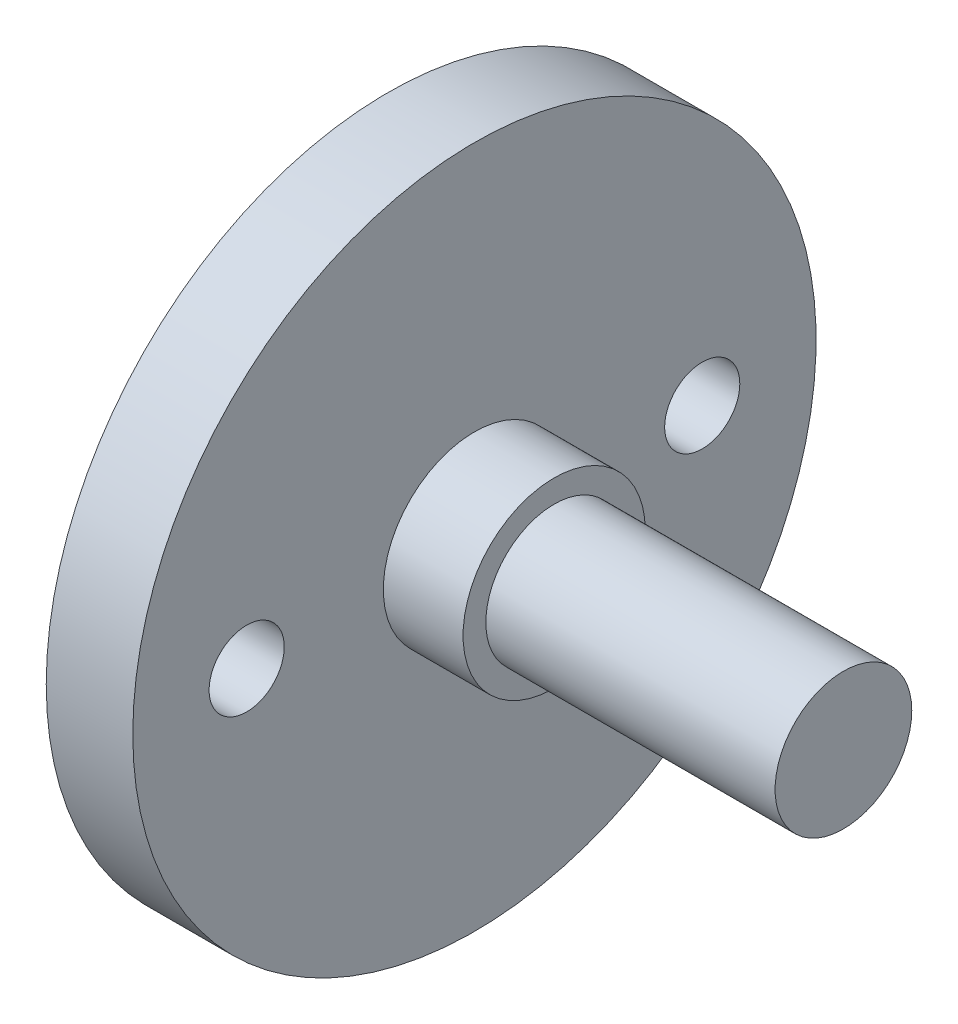
ISO-10303-21;
HEADER;
FILE_DESCRIPTION(('STEP AP214'),'2;1');
FILE_NAME('part.step','',(''),(''),'','','');
FILE_SCHEMA(('AUTOMOTIVE_DESIGN { 1 0 10303 214 1 1 1 1 }'));
ENDSEC;
DATA;
#1=APPLICATION_CONTEXT('core data for automotive mechanical design processes');
#2=APPLICATION_PROTOCOL_DEFINITION('international standard','automotive_design',2000,#1);
#3=PRODUCT_CONTEXT('',#1,'mechanical');
#4=PRODUCT('Part','Part','',(#3));
#5=PRODUCT_RELATED_PRODUCT_CATEGORY('part','',(#4));
#6=PRODUCT_DEFINITION_FORMATION('','',#4);
#7=PRODUCT_DEFINITION_CONTEXT('part definition',#1,'design');
#8=PRODUCT_DEFINITION('design','',#6,#7);
#9=PRODUCT_DEFINITION_SHAPE('','',#8);
#10=(LENGTH_UNIT() NAMED_UNIT(*) SI_UNIT(.MILLI.,.METRE.));
#11=(NAMED_UNIT(*) PLANE_ANGLE_UNIT() SI_UNIT($,.RADIAN.));
#12=(NAMED_UNIT(*) SI_UNIT($,.STERADIAN.) SOLID_ANGLE_UNIT());
#13=UNCERTAINTY_MEASURE_WITH_UNIT(LENGTH_MEASURE(1.E-05),#10,'distance_accuracy_value','');
#14=(GEOMETRIC_REPRESENTATION_CONTEXT(3) GLOBAL_UNCERTAINTY_ASSIGNED_CONTEXT((#13)) GLOBAL_UNIT_ASSIGNED_CONTEXT((#10,
#11,#12)) REPRESENTATION_CONTEXT('',''));
#15=CARTESIAN_POINT('',(0.,0.,0.));
#16=DIRECTION('',(0.,0.,1.));
#17=DIRECTION('',(1.,0.,0.));
#18=AXIS2_PLACEMENT_3D('',#15,#16,#17);
#19=CARTESIAN_POINT('',(10.8,0.,0.));
#20=DIRECTION('',(-1.,0.,0.));
#21=DIRECTION('',(0.,0.,1.));
#22=AXIS2_PLACEMENT_3D('',#19,#20,#21);
#23=CYLINDRICAL_SURFACE('',#22,15.);
#24=CARTESIAN_POINT('',(10.8,0.,0.));
#25=DIRECTION('',(1.,0.,0.));
#26=DIRECTION('',(0.,0.,-1.));
#27=AXIS2_PLACEMENT_3D('',#24,#25,#26);
#28=CIRCLE('',#27,15.);
#29=CARTESIAN_POINT('',(10.8,0.,15.));
#30=VERTEX_POINT('',#29);
#31=EDGE_CURVE('E51',#30,#30,#28,.T.);
#32=CARTESIAN_POINT('',(7.,0.,0.));
#33=DIRECTION('',(-1.,0.,0.));
#34=DIRECTION('',(0.,0.,1.));
#35=AXIS2_PLACEMENT_3D('',#32,#33,#34);
#36=CIRCLE('',#35,15.);
#37=CARTESIAN_POINT('',(7.,0.,15.));
#38=VERTEX_POINT('',#37);
#39=EDGE_CURVE('E71',#38,#38,#36,.T.);
#40=CARTESIAN_POINT('',(10.8,0.,15.));
#41=CARTESIAN_POINT('',(10.7604166666667,0.,15.));
#42=CARTESIAN_POINT('',(10.7208333333333,0.,15.));
#43=CARTESIAN_POINT('',(10.6416666666667,0.,15.));
#44=CARTESIAN_POINT('',(10.6020833333333,0.,15.));
#45=CARTESIAN_POINT('',(10.5229166666667,0.,15.));
#46=CARTESIAN_POINT('',(10.4833333333333,0.,15.));
#47=CARTESIAN_POINT('',(10.4041666666667,0.,15.));
#48=CARTESIAN_POINT('',(10.3645833333333,0.,15.));
#49=CARTESIAN_POINT('',(10.2854166666667,0.,15.));
#50=CARTESIAN_POINT('',(10.2458333333333,0.,15.));
#51=CARTESIAN_POINT('',(10.1666666666667,0.,15.));
#52=CARTESIAN_POINT('',(10.1270833333333,0.,15.));
#53=CARTESIAN_POINT('',(10.0479166666667,0.,15.));
#54=CARTESIAN_POINT('',(10.0083333333333,0.,15.));
#55=CARTESIAN_POINT('',(9.92916666666667,0.,15.));
#56=CARTESIAN_POINT('',(9.88958333333333,0.,15.));
#57=CARTESIAN_POINT('',(9.81041666666667,0.,15.));
#58=CARTESIAN_POINT('',(9.77083333333333,0.,15.));
#59=CARTESIAN_POINT('',(9.69166666666667,0.,15.));
#60=CARTESIAN_POINT('',(9.65208333333333,0.,15.));
#61=CARTESIAN_POINT('',(9.57291666666667,0.,15.));
#62=CARTESIAN_POINT('',(9.53333333333333,0.,15.));
#63=CARTESIAN_POINT('',(9.45416666666667,0.,15.));
#64=CARTESIAN_POINT('',(9.41458333333333,0.,15.));
#65=CARTESIAN_POINT('',(9.33541666666667,0.,15.));
#66=CARTESIAN_POINT('',(9.29583333333333,0.,15.));
#67=CARTESIAN_POINT('',(9.21666666666667,0.,15.));
#68=CARTESIAN_POINT('',(9.17708333333333,0.,15.));
#69=CARTESIAN_POINT('',(9.09791666666667,0.,15.));
#70=CARTESIAN_POINT('',(9.05833333333333,0.,15.));
#71=CARTESIAN_POINT('',(8.97916666666667,0.,15.));
#72=CARTESIAN_POINT('',(8.93958333333333,0.,15.));
#73=CARTESIAN_POINT('',(8.86041666666667,0.,15.));
#74=CARTESIAN_POINT('',(8.82083333333333,0.,15.));
#75=CARTESIAN_POINT('',(8.74166666666667,0.,15.));
#76=CARTESIAN_POINT('',(8.70208333333333,0.,15.));
#77=CARTESIAN_POINT('',(8.62291666666667,0.,15.));
#78=CARTESIAN_POINT('',(8.58333333333333,0.,15.));
#79=CARTESIAN_POINT('',(8.50416666666667,0.,15.));
#80=CARTESIAN_POINT('',(8.46458333333333,0.,15.));
#81=CARTESIAN_POINT('',(8.38541666666667,0.,15.));
#82=CARTESIAN_POINT('',(8.34583333333333,0.,15.));
#83=CARTESIAN_POINT('',(8.26666666666667,0.,15.));
#84=CARTESIAN_POINT('',(8.22708333333333,0.,15.));
#85=CARTESIAN_POINT('',(8.14791666666667,0.,15.));
#86=CARTESIAN_POINT('',(8.10833333333333,0.,15.));
#87=CARTESIAN_POINT('',(8.02916666666667,0.,15.));
#88=CARTESIAN_POINT('',(7.98958333333333,0.,15.));
#89=CARTESIAN_POINT('',(7.91041666666667,0.,15.));
#90=CARTESIAN_POINT('',(7.87083333333333,0.,15.));
#91=CARTESIAN_POINT('',(7.79166666666667,0.,15.));
#92=CARTESIAN_POINT('',(7.75208333333333,0.,15.));
#93=CARTESIAN_POINT('',(7.67291666666667,0.,15.));
#94=CARTESIAN_POINT('',(7.63333333333333,0.,15.));
#95=CARTESIAN_POINT('',(7.55416666666667,0.,15.));
#96=CARTESIAN_POINT('',(7.51458333333333,0.,15.));
#97=CARTESIAN_POINT('',(7.43541666666667,0.,15.));
#98=CARTESIAN_POINT('',(7.39583333333333,0.,15.));
#99=CARTESIAN_POINT('',(7.31666666666667,0.,15.));
#100=CARTESIAN_POINT('',(7.27708333333333,0.,15.));
#101=CARTESIAN_POINT('',(7.19791666666667,0.,15.));
#102=CARTESIAN_POINT('',(7.15833333333333,0.,15.));
#103=CARTESIAN_POINT('',(7.07916666666667,0.,15.));
#104=CARTESIAN_POINT('',(7.03958333333333,0.,15.));
#105=CARTESIAN_POINT('',(7.,0.,15.));
#106=B_SPLINE_CURVE_WITH_KNOTS('',3,(#40,#41,#42,#43,#44,#45,#46,#47,#48,#49,#50,#51,#52,#53,
#54,#55,#56,#57,#58,#59,#60,#61,#62,#63,#64,#65,#66,#67,#68,#69,#70,#71,#72,#73,#74,#75,#76,#77,
#78,#79,#80,#81,#82,#83,#84,#85,#86,#87,#88,#89,#90,#91,#92,#93,#94,#95,#96,#97,#98,#99,#100,
#101,#102,#103,#104,#105),.UNSPECIFIED.,.F.,.F.,(4,2,2,2,2,2,2,2,2,2,2,2,2,2,2,2,2,2,2,2,2,2,2,
2,2,2,2,2,2,2,2,2,4),(0.,0.118750000000001,0.237500000000002,0.356250000000001,
0.475000000000001,0.593750000000001,0.712500000000001,0.83125,0.950000000000001,1.06875,1.1875,
1.30625,1.425,1.54375,1.6625,1.78125,1.9,2.01875,2.1375,2.25625,2.375,2.49375,2.6125,2.73125,
2.85,2.96875,3.0875,3.20625,3.325,3.44375,3.5625,3.68125,3.8),.UNSPECIFIED.);
#107=EDGE_CURVE('BSEAM37',#30,#38,#106,.T.);
#108=ORIENTED_EDGE('',*,*,#31,.F.);
#109=ORIENTED_EDGE('',*,*,#39,.F.);
#110=ORIENTED_EDGE('',*,*,#107,.T.);
#111=ORIENTED_EDGE('',*,*,#107,.F.);
#112=EDGE_LOOP('',(#108,#110,#109,#111));
#113=FACE_BOUND('',#112,.T.);
#114=ADVANCED_FACE('F37',(#113),#23,.T.);
#115=CARTESIAN_POINT('',(20.1,0.,-10.));
#116=DIRECTION('',(-1.,0.,0.));
#117=DIRECTION('',(0.,0.,1.));
#118=AXIS2_PLACEMENT_3D('',#115,#116,#117);
#119=CYLINDRICAL_SURFACE('',#118,1.65);
#120=CARTESIAN_POINT('',(10.8,0.,-10.));
#121=DIRECTION('',(1.,0.,0.));
#122=DIRECTION('',(0.,0.,-1.));
#123=AXIS2_PLACEMENT_3D('',#120,#121,#122);
#124=CIRCLE('',#123,1.65);
#125=CARTESIAN_POINT('',(10.8,0.,-11.65));
#126=VERTEX_POINT('',#125);
#127=EDGE_CURVE('E85',#126,#126,#124,.T.);
#128=ORIENTED_EDGE('',*,*,#127,.T.);
#129=EDGE_LOOP('',(#128));
#130=FACE_BOUND('',#129,.T.);
#131=CARTESIAN_POINT('',(7.,0.,-10.));
#132=DIRECTION('',(-1.,0.,0.));
#133=DIRECTION('',(0.,0.,1.));
#134=AXIS2_PLACEMENT_3D('',#131,#132,#133);
#135=CIRCLE('',#134,1.65);
#136=CARTESIAN_POINT('',(7.,0.,-8.35));
#137=VERTEX_POINT('',#136);
#138=EDGE_CURVE('E77',#137,#137,#135,.F.);
#139=ORIENTED_EDGE('',*,*,#138,.F.);
#140=EDGE_LOOP('',(#139));
#141=FACE_BOUND('',#140,.T.);
#142=ADVANCED_FACE('F68',(#130,#141),#119,.F.);
#143=CARTESIAN_POINT('',(20.1,0.,10.));
#144=DIRECTION('',(-1.,0.,0.));
#145=DIRECTION('',(0.,0.,1.));
#146=AXIS2_PLACEMENT_3D('',#143,#144,#145);
#147=CYLINDRICAL_SURFACE('',#146,1.65);
#148=CARTESIAN_POINT('',(10.8,0.,10.));
#149=DIRECTION('',(1.,0.,0.));
#150=DIRECTION('',(0.,0.,-1.));
#151=AXIS2_PLACEMENT_3D('',#148,#149,#150);
#152=CIRCLE('',#151,1.65);
#153=CARTESIAN_POINT('',(10.8,0.,8.35));
#154=VERTEX_POINT('',#153);
#155=EDGE_CURVE('E55',#154,#154,#152,.T.);
#156=ORIENTED_EDGE('',*,*,#155,.T.);
#157=EDGE_LOOP('',(#156));
#158=FACE_BOUND('',#157,.T.);
#159=CARTESIAN_POINT('',(7.,0.,10.));
#160=DIRECTION('',(-1.,0.,0.));
#161=DIRECTION('',(0.,0.,1.));
#162=AXIS2_PLACEMENT_3D('',#159,#160,#161);
#163=CIRCLE('',#162,1.65);
#164=CARTESIAN_POINT('',(7.,0.,11.65));
#165=VERTEX_POINT('',#164);
#166=EDGE_CURVE('E40',#165,#165,#163,.F.);
#167=ORIENTED_EDGE('',*,*,#166,.F.);
#168=EDGE_LOOP('',(#167));
#169=FACE_BOUND('',#168,.T.);
#170=ADVANCED_FACE('F94',(#158,#169),#147,.F.);
#171=CARTESIAN_POINT('',(10.8,0.,0.));
#172=DIRECTION('',(1.,0.,0.));
#173=DIRECTION('',(0.,0.,-1.));
#174=AXIS2_PLACEMENT_3D('',#171,#172,#173);
#175=PLANE('',#174);
#176=ORIENTED_EDGE('',*,*,#155,.F.);
#177=EDGE_LOOP('',(#176));
#178=FACE_BOUND('',#177,.T.);
#179=ORIENTED_EDGE('',*,*,#127,.F.);
#180=EDGE_LOOP('',(#179));
#181=FACE_BOUND('',#180,.T.);
#182=CARTESIAN_POINT('',(10.8,0.,0.));
#183=DIRECTION('',(1.,0.,0.));
#184=DIRECTION('',(0.,0.,-1.));
#185=AXIS2_PLACEMENT_3D('',#182,#183,#184);
#186=CIRCLE('',#185,4.);
#187=CARTESIAN_POINT('',(10.8,0.,-4.));
#188=VERTEX_POINT('',#187);
#189=EDGE_CURVE('E45',#188,#188,#186,.T.);
#190=ORIENTED_EDGE('',*,*,#189,.F.);
#191=EDGE_LOOP('',(#190));
#192=FACE_BOUND('',#191,.T.);
#193=ORIENTED_EDGE('',*,*,#31,.T.);
#194=EDGE_LOOP('',(#193));
#195=FACE_BOUND('',#194,.T.);
#196=ADVANCED_FACE('F64',(#178,#181,#192,#195),#175,.T.);
#197=CARTESIAN_POINT('',(14.3,0.,0.));
#198=DIRECTION('',(-1.,0.,0.));
#199=DIRECTION('',(0.,0.,1.));
#200=AXIS2_PLACEMENT_3D('',#197,#198,#199);
#201=CYLINDRICAL_SURFACE('',#200,4.);
#202=CARTESIAN_POINT('',(14.3,0.,0.));
#203=DIRECTION('',(1.,0.,0.));
#204=DIRECTION('',(0.,0.,-1.));
#205=AXIS2_PLACEMENT_3D('',#202,#203,#204);
#206=CIRCLE('',#205,4.);
#207=CARTESIAN_POINT('',(14.3,0.,-4.));
#208=VERTEX_POINT('',#207);
#209=EDGE_CURVE('E57',#208,#208,#206,.T.);
#210=ORIENTED_EDGE('',*,*,#209,.F.);
#211=EDGE_LOOP('',(#210));
#212=FACE_BOUND('',#211,.T.);
#213=ORIENTED_EDGE('',*,*,#189,.T.);
#214=EDGE_LOOP('',(#213));
#215=FACE_BOUND('',#214,.T.);
#216=ADVANCED_FACE('F99',(#212,#215),#201,.T.);
#217=CARTESIAN_POINT('',(14.3,0.,0.));
#218=DIRECTION('',(1.,0.,0.));
#219=DIRECTION('',(0.,0.,-1.));
#220=AXIS2_PLACEMENT_3D('',#217,#218,#219);
#221=PLANE('',#220);
#222=CARTESIAN_POINT('',(14.3,0.,0.));
#223=DIRECTION('',(1.,0.,0.));
#224=DIRECTION('',(0.,0.,-1.));
#225=AXIS2_PLACEMENT_3D('',#222,#223,#224);
#226=CIRCLE('',#225,3.);
#227=CARTESIAN_POINT('',(14.3,0.,-3.));
#228=VERTEX_POINT('',#227);
#229=EDGE_CURVE('E10',#228,#228,#226,.T.);
#230=ORIENTED_EDGE('',*,*,#229,.F.);
#231=EDGE_LOOP('',(#230));
#232=FACE_BOUND('',#231,.T.);
#233=ORIENTED_EDGE('',*,*,#209,.T.);
#234=EDGE_LOOP('',(#233));
#235=FACE_BOUND('',#234,.T.);
#236=ADVANCED_FACE('F104',(#232,#235),#221,.T.);
#237=CARTESIAN_POINT('',(20.1,0.,0.));
#238=DIRECTION('',(-1.,0.,0.));
#239=DIRECTION('',(0.,0.,1.));
#240=AXIS2_PLACEMENT_3D('',#237,#238,#239);
#241=CYLINDRICAL_SURFACE('',#240,3.);
#242=ORIENTED_EDGE('',*,*,#229,.T.);
#243=EDGE_LOOP('',(#242));
#244=FACE_BOUND('',#243,.T.);
#245=CARTESIAN_POINT('',(27.,0.,0.));
#246=DIRECTION('',(1.,0.,0.));
#247=DIRECTION('',(0.,0.,-1.));
#248=AXIS2_PLACEMENT_3D('',#245,#246,#247);
#249=CIRCLE('',#248,3.);
#250=CARTESIAN_POINT('',(27.,0.,-3.));
#251=VERTEX_POINT('',#250);
#252=EDGE_CURVE('E82',#251,#251,#249,.T.);
#253=ORIENTED_EDGE('',*,*,#252,.F.);
#254=EDGE_LOOP('',(#253));
#255=FACE_BOUND('',#254,.T.);
#256=ADVANCED_FACE('F110',(#244,#255),#241,.T.);
#257=CARTESIAN_POINT('',(27.,0.,0.));
#258=DIRECTION('',(1.,0.,0.));
#259=DIRECTION('',(0.,0.,-1.));
#260=AXIS2_PLACEMENT_3D('',#257,#258,#259);
#261=PLANE('',#260);
#262=ORIENTED_EDGE('',*,*,#252,.T.);
#263=EDGE_LOOP('',(#262));
#264=FACE_BOUND('',#263,.T.);
#265=ADVANCED_FACE('F117',(#264),#261,.T.);
#266=CARTESIAN_POINT('',(7.,0.,0.));
#267=DIRECTION('',(-1.,0.,0.));
#268=DIRECTION('',(0.,0.,1.));
#269=AXIS2_PLACEMENT_3D('',#266,#267,#268);
#270=PLANE('',#269);
#271=ORIENTED_EDGE('',*,*,#39,.T.);
#272=EDGE_LOOP('',(#271));
#273=FACE_BOUND('',#272,.T.);
#274=ORIENTED_EDGE('',*,*,#166,.T.);
#275=EDGE_LOOP('',(#274));
#276=FACE_BOUND('',#275,.T.);
#277=ORIENTED_EDGE('',*,*,#138,.T.);
#278=EDGE_LOOP('',(#277));
#279=FACE_BOUND('',#278,.T.);
#280=ADVANCED_FACE('F124',(#273,#276,#279),#270,.T.);
#281=CLOSED_SHELL('',(#114,#142,#170,#196,#216,#236,#256,#265,#280));
#282=MANIFOLD_SOLID_BREP('B2',#281);
#283=ADVANCED_BREP_SHAPE_REPRESENTATION('',(#18,#282),#14);
#284=SHAPE_DEFINITION_REPRESENTATION(#9,#283);
ENDSEC;
END-ISO-10303-21;
